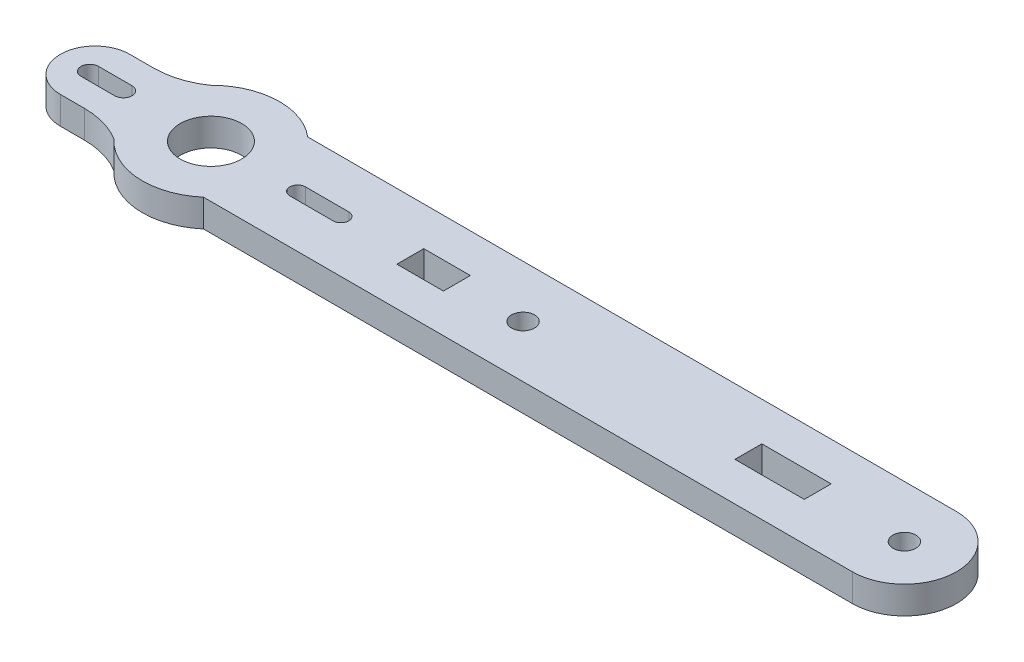
ISO-10303-21;
HEADER;
FILE_DESCRIPTION(('STEP AP214'),'2;1');
FILE_NAME('part.step','',(''),(''),'','','');
FILE_SCHEMA(('AUTOMOTIVE_DESIGN { 1 0 10303 214 1 1 1 1 }'));
ENDSEC;
DATA;
#1=APPLICATION_CONTEXT('core data for automotive mechanical design processes');
#2=APPLICATION_PROTOCOL_DEFINITION('international standard','automotive_design',2000,#1);
#3=PRODUCT_CONTEXT('',#1,'mechanical');
#4=PRODUCT('Part','Part','',(#3));
#5=PRODUCT_RELATED_PRODUCT_CATEGORY('part','',(#4));
#6=PRODUCT_DEFINITION_FORMATION('','',#4);
#7=PRODUCT_DEFINITION_CONTEXT('part definition',#1,'design');
#8=PRODUCT_DEFINITION('design','',#6,#7);
#9=PRODUCT_DEFINITION_SHAPE('','',#8);
#10=(LENGTH_UNIT() NAMED_UNIT(*) SI_UNIT(.MILLI.,.METRE.));
#11=(NAMED_UNIT(*) PLANE_ANGLE_UNIT() SI_UNIT($,.RADIAN.));
#12=(NAMED_UNIT(*) SI_UNIT($,.STERADIAN.) SOLID_ANGLE_UNIT());
#13=UNCERTAINTY_MEASURE_WITH_UNIT(LENGTH_MEASURE(1.E-05),#10,'distance_accuracy_value','');
#14=(GEOMETRIC_REPRESENTATION_CONTEXT(3) GLOBAL_UNCERTAINTY_ASSIGNED_CONTEXT((#13)) GLOBAL_UNIT_ASSIGNED_CONTEXT((#10,
#11,#12)) REPRESENTATION_CONTEXT('',''));
#15=CARTESIAN_POINT('',(0.,0.,0.));
#16=DIRECTION('',(0.,0.,1.));
#17=DIRECTION('',(1.,0.,0.));
#18=AXIS2_PLACEMENT_3D('',#15,#16,#17);
#19=CARTESIAN_POINT('',(-46.1508881650413,3.175,12.73172366087));
#20=DIRECTION('',(0.,-1.,0.));
#21=DIRECTION('',(0.,0.,-1.));
#22=AXIS2_PLACEMENT_3D('',#19,#20,#21);
#23=PLANE('',#22);
#24=CARTESIAN_POINT('',(-20.5826645707768,3.175,-0.385085228693363));
#25=DIRECTION('',(0.,1.,0.));
#26=DIRECTION('',(0.,0.,-1.));
#27=AXIS2_PLACEMENT_3D('',#24,#25,#26);
#28=CIRCLE('',#27,0.899974349717586);
#29=CARTESIAN_POINT('',(-20.5826645707768,3.175,0.514889121024237));
#30=VERTEX_POINT('',#29);
#31=CARTESIAN_POINT('',(-20.5826645707768,3.175,-1.28505957841094));
#32=VERTEX_POINT('',#31);
#33=EDGE_CURVE('E242',#30,#32,#28,.T.);
#34=ORIENTED_EDGE('',*,*,#33,.F.);
#35=DIRECTION('',(1.,0.,0.));
#36=VECTOR('',#35,1.);
#37=CARTESIAN_POINT('',(-20.5826645707768,3.175,0.514889121024237));
#38=LINE('',#37,#36);
#39=CARTESIAN_POINT('',(-25.5738409854409,3.175,0.514889121024237));
#40=VERTEX_POINT('',#39);
#41=EDGE_CURVE('E250',#40,#30,#38,.T.);
#42=ORIENTED_EDGE('',*,*,#41,.F.);
#43=CARTESIAN_POINT('',(-25.5738409854409,3.175,-0.385085228693349));
#44=DIRECTION('',(0.,1.,0.));
#45=DIRECTION('',(0.,0.,1.));
#46=AXIS2_PLACEMENT_3D('',#43,#44,#45);
#47=CIRCLE('',#46,0.899974349717586);
#48=CARTESIAN_POINT('',(-25.5738409854409,3.175,-1.28505957841094));
#49=VERTEX_POINT('',#48);
#50=EDGE_CURVE('E247',#49,#40,#47,.T.);
#51=ORIENTED_EDGE('',*,*,#50,.F.);
#52=DIRECTION('',(-1.,0.,0.));
#53=VECTOR('',#52,1.);
#54=CARTESIAN_POINT('',(-25.5738409854409,3.175,-1.28505957841094));
#55=LINE('',#54,#53);
#56=EDGE_CURVE('E244',#32,#49,#55,.T.);
#57=ORIENTED_EDGE('',*,*,#56,.F.);
#58=EDGE_LOOP('',(#34,#42,#51,#57));
#59=FACE_BOUND('',#58,.T.);
#60=DIRECTION('',(-1.,0.,0.));
#61=VECTOR('',#60,1.);
#62=CARTESIAN_POINT('',(34.3200127772081,3.175,-1.93514359702635));
#63=LINE('',#62,#61);
#64=CARTESIAN_POINT('',(34.3200127772081,3.175,-1.93514359702635));
#65=VERTEX_POINT('',#64);
#66=CARTESIAN_POINT('',(26.3341227148356,3.175,-1.93514359702635));
#67=VERTEX_POINT('',#66);
#68=EDGE_CURVE('E306',#65,#67,#63,.T.);
#69=ORIENTED_EDGE('',*,*,#68,.F.);
#70=DIRECTION('',(0.,0.,-1.));
#71=VECTOR('',#70,1.);
#72=CARTESIAN_POINT('',(34.3200127772081,3.175,1.1148524905702));
#73=LINE('',#72,#71);
#74=CARTESIAN_POINT('',(34.3200127772081,3.175,1.16497314430927));
#75=VERTEX_POINT('',#74);
#76=EDGE_CURVE('E304',#75,#65,#73,.T.);
#77=ORIENTED_EDGE('',*,*,#76,.F.);
#78=DIRECTION('',(1.,0.,0.));
#79=VECTOR('',#78,1.);
#80=CARTESIAN_POINT('',(26.3341227148356,3.175,1.16497314430927));
#81=LINE('',#80,#79);
#82=CARTESIAN_POINT('',(26.3341227148356,3.175,1.16497314430927));
#83=VERTEX_POINT('',#82);
#84=EDGE_CURVE('E311',#83,#75,#81,.T.);
#85=ORIENTED_EDGE('',*,*,#84,.F.);
#86=DIRECTION('',(0.,0.,1.));
#87=VECTOR('',#86,1.);
#88=CARTESIAN_POINT('',(26.3341227148356,3.175,-1.93514359702635));
#89=LINE('',#88,#87);
#90=EDGE_CURVE('E309',#67,#83,#89,.T.);
#91=ORIENTED_EDGE('',*,*,#90,.F.);
#92=EDGE_LOOP('',(#69,#77,#85,#91));
#93=FACE_BOUND('',#92,.T.);
#94=CARTESIAN_POINT('',(-46.1508881650413,3.175,12.73172366087));
#95=DIRECTION('',(0.,-1.,0.));
#96=DIRECTION('',(0.,0.,-1.));
#97=AXIS2_PLACEMENT_3D('',#94,#95,#96);
#98=CIRCLE('',#97,9.12131960573424);
#99=CARTESIAN_POINT('',(-46.1508881650413,3.175,3.61040405513577));
#100=VERTEX_POINT('',#99);
#101=CARTESIAN_POINT('',(-41.3809650965985,3.175,4.95700146190436));
#102=VERTEX_POINT('',#101);
#103=EDGE_CURVE('E353',#100,#102,#98,.T.);
#104=ORIENTED_EDGE('',*,*,#103,.T.);
#105=CARTESIAN_POINT('',(-35.5598693133355,3.175,-0.389755399260115));
#106=DIRECTION('',(0.,1.,0.));
#107=DIRECTION('',(0.,0.,1.));
#108=AXIS2_PLACEMENT_3D('',#105,#106,#107);
#109=CIRCLE('',#108,7.90398412513158);
#110=CARTESIAN_POINT('',(-30.4203086036687,3.175,5.61506606036555));
#111=VERTEX_POINT('',#110);
#112=EDGE_CURVE('E356',#102,#111,#109,.T.);
#113=ORIENTED_EDGE('',*,*,#112,.T.);
#114=DIRECTION('',(1.,0.,0.));
#115=VECTOR('',#114,1.);
#116=CARTESIAN_POINT('',(-30.4203086036687,3.175,5.61506606036555));
#117=LINE('',#116,#115);
#118=CARTESIAN_POINT('',(44.3021859087163,3.175,5.61506606036555));
#119=VERTEX_POINT('',#118);
#120=EDGE_CURVE('E359',#111,#119,#117,.T.);
#121=ORIENTED_EDGE('',*,*,#120,.T.);
#122=CARTESIAN_POINT('',(44.3021859087163,3.175,-0.387483181452966));
#123=DIRECTION('',(0.,1.,0.));
#124=DIRECTION('',(0.,0.,1.));
#125=AXIS2_PLACEMENT_3D('',#122,#123,#124);
#126=CIRCLE('',#125,6.00254924181851);
#127=CARTESIAN_POINT('',(44.3021859087163,3.175,-6.39003242327148));
#128=VERTEX_POINT('',#127);
#129=EDGE_CURVE('E361',#119,#128,#126,.T.);
#130=ORIENTED_EDGE('',*,*,#129,.T.);
#131=DIRECTION('',(-0.999999998208426,0.,-5.98593977840494E-05));
#132=VECTOR('',#131,1.);
#133=CARTESIAN_POINT('',(-30.420224954168,3.175,-6.39450526179472));
#134=LINE('',#133,#132);
#135=CARTESIAN_POINT('',(-30.420224954168,3.175,-6.39450526179472));
#136=VERTEX_POINT('',#135);
#137=EDGE_CURVE('E363',#128,#136,#134,.T.);
#138=ORIENTED_EDGE('',*,*,#137,.T.);
#139=CARTESIAN_POINT('',(-35.5598693133355,3.175,-0.389755399260115));
#140=DIRECTION('',(0.,1.,0.));
#141=DIRECTION('',(0.,0.,1.));
#142=AXIS2_PLACEMENT_3D('',#139,#140,#141);
#143=CIRCLE('',#142,7.90398412513158);
#144=CARTESIAN_POINT('',(-41.2087863988386,3.175,-5.91810965811905));
#145=VERTEX_POINT('',#144);
#146=EDGE_CURVE('E365',#136,#145,#143,.T.);
#147=ORIENTED_EDGE('',*,*,#146,.T.);
#148=CARTESIAN_POINT('',(-46.1508881650413,3.175,-13.1454849063283));
#149=DIRECTION('',(0.,-1.,0.));
#150=DIRECTION('',(0.,0.,1.));
#151=AXIS2_PLACEMENT_3D('',#148,#149,#150);
#152=CIRCLE('',#151,8.75553098595006);
#153=CARTESIAN_POINT('',(-46.1508881650413,3.175,-4.38995392037821));
#154=VERTEX_POINT('',#153);
#155=EDGE_CURVE('E367',#145,#154,#152,.T.);
#156=ORIENTED_EDGE('',*,*,#155,.T.);
#157=DIRECTION('',(-1.,0.,0.));
#158=VECTOR('',#157,1.);
#159=CARTESIAN_POINT('',(-46.1508881650413,3.175,-4.38995392037821));
#160=LINE('',#159,#158);
#161=CARTESIAN_POINT('',(-48.9096652526682,3.175,-4.38995392037821));
#162=VERTEX_POINT('',#161);
#163=EDGE_CURVE('E369',#154,#162,#160,.T.);
#164=ORIENTED_EDGE('',*,*,#163,.T.);
#165=CARTESIAN_POINT('',(-48.9096652526682,3.175,-0.389774932621221));
#166=DIRECTION('',(0.,1.,0.));
#167=DIRECTION('',(0.,0.,1.));
#168=AXIS2_PLACEMENT_3D('',#165,#166,#167);
#169=CIRCLE('',#168,4.00017898775699);
#170=CARTESIAN_POINT('',(-48.9096652526682,3.175,3.61040405513577));
#171=VERTEX_POINT('',#170);
#172=EDGE_CURVE('E371',#162,#171,#169,.T.);
#173=ORIENTED_EDGE('',*,*,#172,.T.);
#174=DIRECTION('',(1.,0.,0.));
#175=VECTOR('',#174,1.);
#176=CARTESIAN_POINT('',(-48.9096652526682,3.175,3.61040405513577));
#177=LINE('',#176,#175);
#178=EDGE_CURVE('E373',#171,#100,#177,.T.);
#179=ORIENTED_EDGE('',*,*,#178,.T.);
#180=EDGE_LOOP('',(#104,#113,#121,#130,#138,#147,#156,#164,#173,#179));
#181=FACE_BOUND('',#180,.T.);
#182=CARTESIAN_POINT('',(44.3021859087163,3.175,-0.387483181452966));
#183=DIRECTION('',(0.,1.,0.));
#184=DIRECTION('',(0.,0.,1.));
#185=AXIS2_PLACEMENT_3D('',#182,#183,#184);
#186=CIRCLE('',#185,1.32262221921054);
#187=CARTESIAN_POINT('',(44.3021859087163,3.175,0.93513903775757));
#188=VERTEX_POINT('',#187);
#189=EDGE_CURVE('E347',#188,#188,#186,.T.);
#190=ORIENTED_EDGE('',*,*,#189,.F.);
#191=EDGE_LOOP('',(#190));
#192=FACE_BOUND('',#191,.T.);
#193=CARTESIAN_POINT('',(0.383109325227615,3.175,-0.385153591561826));
#194=DIRECTION('',(0.,1.,0.));
#195=DIRECTION('',(0.,0.,1.));
#196=AXIS2_PLACEMENT_3D('',#193,#194,#195);
#197=CIRCLE('',#196,1.32262221921054);
#198=CARTESIAN_POINT('',(0.383109325227615,3.175,0.93746862764871));
#199=VERTEX_POINT('',#198);
#200=EDGE_CURVE('E341',#199,#199,#197,.T.);
#201=ORIENTED_EDGE('',*,*,#200,.F.);
#202=EDGE_LOOP('',(#201));
#203=FACE_BOUND('',#202,.T.);
#204=CARTESIAN_POINT('',(-35.5598693133355,3.175,-0.389755399260115));
#205=DIRECTION('',(0.,1.,0.));
#206=DIRECTION('',(0.,0.,1.));
#207=AXIS2_PLACEMENT_3D('',#204,#205,#206);
#208=CIRCLE('',#207,3.54358151821535);
#209=CARTESIAN_POINT('',(-35.5598693133355,3.175,3.15382611895524));
#210=VERTEX_POINT('',#209);
#211=EDGE_CURVE('E335',#210,#210,#208,.T.);
#212=ORIENTED_EDGE('',*,*,#211,.F.);
#213=EDGE_LOOP('',(#212));
#214=FACE_BOUND('',#213,.T.);
#215=DIRECTION('',(0.,0.,-1.));
#216=VECTOR('',#215,1.);
#217=CARTESIAN_POINT('',(-7.23312209646554,3.175,1.16477781654983));
#218=LINE('',#217,#216);
#219=CARTESIAN_POINT('',(-7.23312209646554,3.175,1.16477781654983));
#220=VERTEX_POINT('',#219);
#221=CARTESIAN_POINT('',(-7.23312209646554,3.175,-1.93494827276897));
#222=VERTEX_POINT('',#221);
#223=EDGE_CURVE('E273',#220,#222,#218,.T.);
#224=ORIENTED_EDGE('',*,*,#223,.F.);
#225=DIRECTION('',(1.,0.,0.));
#226=VECTOR('',#225,1.);
#227=CARTESIAN_POINT('',(-12.5967647598336,3.175,1.16477781654983));
#228=LINE('',#227,#226);
#229=CARTESIAN_POINT('',(-12.5967647598336,3.175,1.16477781654983));
#230=VERTEX_POINT('',#229);
#231=EDGE_CURVE('E281',#230,#220,#228,.T.);
#232=ORIENTED_EDGE('',*,*,#231,.F.);
#233=DIRECTION('',(0.,0.,1.));
#234=VECTOR('',#233,1.);
#235=CARTESIAN_POINT('',(-12.5967647598336,3.175,-1.93494827276897));
#236=LINE('',#235,#234);
#237=CARTESIAN_POINT('',(-12.5967647598336,3.175,-1.93494827276897));
#238=VERTEX_POINT('',#237);
#239=EDGE_CURVE('E278',#238,#230,#236,.T.);
#240=ORIENTED_EDGE('',*,*,#239,.F.);
#241=DIRECTION('',(-1.,0.,0.));
#242=VECTOR('',#241,1.);
#243=CARTESIAN_POINT('',(-7.23312209646554,3.175,-1.93494827276897));
#244=LINE('',#243,#242);
#245=EDGE_CURVE('E275',#222,#238,#244,.T.);
#246=ORIENTED_EDGE('',*,*,#245,.F.);
#247=EDGE_LOOP('',(#224,#232,#240,#246));
#248=FACE_BOUND('',#247,.T.);
#249=CARTESIAN_POINT('',(-49.5122186161084,3.175,-0.385182892774616));
#250=DIRECTION('',(0.,1.,0.));
#251=DIRECTION('',(0.,0.,1.));
#252=AXIS2_PLACEMENT_3D('',#249,#250,#251);
#253=CIRCLE('',#252,1.00003986378883);
#254=CARTESIAN_POINT('',(-49.5122186161084,3.175,-1.38522275656344));
#255=VERTEX_POINT('',#254);
#256=CARTESIAN_POINT('',(-49.5122186161084,3.175,0.61485697101421));
#257=VERTEX_POINT('',#256);
#258=EDGE_CURVE('E206',#255,#257,#253,.T.);
#259=ORIENTED_EDGE('',*,*,#258,.F.);
#260=DIRECTION('',(-1.,0.,0.));
#261=VECTOR('',#260,1.);
#262=CARTESIAN_POINT('',(-49.5122186161084,3.175,-1.38522275656344));
#263=LINE('',#262,#261);
#264=CARTESIAN_POINT('',(-45.6380802478693,3.175,-1.38522275656344));
#265=VERTEX_POINT('',#264);
#266=EDGE_CURVE('E228',#265,#255,#263,.T.);
#267=ORIENTED_EDGE('',*,*,#266,.F.);
#268=CARTESIAN_POINT('',(-45.6380802478693,3.175,-0.385182892774616));
#269=DIRECTION('',(0.,1.,0.));
#270=DIRECTION('',(0.,0.,-1.));
#271=AXIS2_PLACEMENT_3D('',#268,#269,#270);
#272=CIRCLE('',#271,1.00003986378883);
#273=CARTESIAN_POINT('',(-45.6380802478693,3.175,0.61485697101421));
#274=VERTEX_POINT('',#273);
#275=EDGE_CURVE('E226',#274,#265,#272,.T.);
#276=ORIENTED_EDGE('',*,*,#275,.F.);
#277=DIRECTION('',(1.,0.,0.));
#278=VECTOR('',#277,1.);
#279=CARTESIAN_POINT('',(-45.6380802478693,3.175,0.61485697101421));
#280=LINE('',#279,#278);
#281=EDGE_CURVE('E214',#257,#274,#280,.T.);
#282=ORIENTED_EDGE('',*,*,#281,.F.);
#283=EDGE_LOOP('',(#259,#267,#276,#282));
#284=FACE_BOUND('',#283,.T.);
#285=ADVANCED_FACE('F33',(#59,#93,#181,#192,#203,#214,#248,#284),#23,.F.);
#286=CARTESIAN_POINT('',(-46.1508881650413,0.,12.73172366087));
#287=DIRECTION('',(0.,-1.,0.));
#288=DIRECTION('',(0.,0.,-1.));
#289=AXIS2_PLACEMENT_3D('',#286,#287,#288);
#290=PLANE('',#289);
#291=CARTESIAN_POINT('',(0.383109325227615,0.,-0.385153591561826));
#292=DIRECTION('',(0.,1.,0.));
#293=DIRECTION('',(0.,0.,1.));
#294=AXIS2_PLACEMENT_3D('',#291,#292,#293);
#295=CIRCLE('',#294,1.32262221921054);
#296=CARTESIAN_POINT('',(0.383109325227615,0.,0.93746862764871));
#297=VERTEX_POINT('',#296);
#298=EDGE_CURVE('E338',#297,#297,#295,.T.);
#299=ORIENTED_EDGE('',*,*,#298,.T.);
#300=EDGE_LOOP('',(#299));
#301=FACE_BOUND('',#300,.T.);
#302=CARTESIAN_POINT('',(-46.1508881650413,0.,12.73172366087));
#303=DIRECTION('',(0.,-1.,0.));
#304=DIRECTION('',(0.,0.,-1.));
#305=AXIS2_PLACEMENT_3D('',#302,#303,#304);
#306=CIRCLE('',#305,9.12131960573424);
#307=CARTESIAN_POINT('',(-46.1508881650413,0.,3.61040405513577));
#308=VERTEX_POINT('',#307);
#309=CARTESIAN_POINT('',(-41.3809650965985,0.,4.95700146190436));
#310=VERTEX_POINT('',#309);
#311=EDGE_CURVE('E350',#308,#310,#306,.T.);
#312=ORIENTED_EDGE('',*,*,#311,.F.);
#313=DIRECTION('',(1.,0.,0.));
#314=VECTOR('',#313,1.);
#315=CARTESIAN_POINT('',(-48.9096652526682,0.,3.61040405513577));
#316=LINE('',#315,#314);
#317=CARTESIAN_POINT('',(-48.9096652526682,0.,3.61040405513577));
#318=VERTEX_POINT('',#317);
#319=EDGE_CURVE('E357',#318,#308,#316,.T.);
#320=ORIENTED_EDGE('',*,*,#319,.F.);
#321=CARTESIAN_POINT('',(-48.9096652526682,0.,-0.389774932621221));
#322=DIRECTION('',(0.,1.,0.));
#323=DIRECTION('',(0.,0.,1.));
#324=AXIS2_PLACEMENT_3D('',#321,#322,#323);
#325=CIRCLE('',#324,4.00017898775699);
#326=CARTESIAN_POINT('',(-48.9096652526682,0.,-4.38995392037821));
#327=VERTEX_POINT('',#326);
#328=EDGE_CURVE('E392',#327,#318,#325,.T.);
#329=ORIENTED_EDGE('',*,*,#328,.F.);
#330=DIRECTION('',(-1.,0.,0.));
#331=VECTOR('',#330,1.);
#332=CARTESIAN_POINT('',(-46.1508881650413,0.,-4.38995392037821));
#333=LINE('',#332,#331);
#334=CARTESIAN_POINT('',(-46.1508881650413,0.,-4.38995392037821));
#335=VERTEX_POINT('',#334);
#336=EDGE_CURVE('E390',#335,#327,#333,.T.);
#337=ORIENTED_EDGE('',*,*,#336,.F.);
#338=CARTESIAN_POINT('',(-46.1508881650413,0.,-13.1454849063283));
#339=DIRECTION('',(0.,-1.,0.));
#340=DIRECTION('',(0.,0.,1.));
#341=AXIS2_PLACEMENT_3D('',#338,#339,#340);
#342=CIRCLE('',#341,8.75553098595006);
#343=CARTESIAN_POINT('',(-41.2087863988386,0.,-5.91810965811905));
#344=VERTEX_POINT('',#343);
#345=EDGE_CURVE('E388',#344,#335,#342,.T.);
#346=ORIENTED_EDGE('',*,*,#345,.F.);
#347=CARTESIAN_POINT('',(-35.5598693133355,0.,-0.389755399260115));
#348=DIRECTION('',(0.,1.,0.));
#349=DIRECTION('',(0.,0.,1.));
#350=AXIS2_PLACEMENT_3D('',#347,#348,#349);
#351=CIRCLE('',#350,7.90398412513158);
#352=CARTESIAN_POINT('',(-30.420224954168,0.,-6.39450526179472));
#353=VERTEX_POINT('',#352);
#354=EDGE_CURVE('E386',#353,#344,#351,.T.);
#355=ORIENTED_EDGE('',*,*,#354,.F.);
#356=DIRECTION('',(-0.999999998208426,0.,-5.98593977840494E-05));
#357=VECTOR('',#356,1.);
#358=CARTESIAN_POINT('',(-30.420224954168,0.,-6.39450526179472));
#359=LINE('',#358,#357);
#360=CARTESIAN_POINT('',(44.3021859087163,0.,-6.39003242327148));
#361=VERTEX_POINT('',#360);
#362=EDGE_CURVE('E384',#361,#353,#359,.T.);
#363=ORIENTED_EDGE('',*,*,#362,.F.);
#364=CARTESIAN_POINT('',(44.3021859087163,0.,-0.387483181452966));
#365=DIRECTION('',(0.,1.,0.));
#366=DIRECTION('',(0.,0.,1.));
#367=AXIS2_PLACEMENT_3D('',#364,#365,#366);
#368=CIRCLE('',#367,6.00254924181851);
#369=CARTESIAN_POINT('',(44.3021859087163,0.,5.61506606036555));
#370=VERTEX_POINT('',#369);
#371=EDGE_CURVE('E382',#370,#361,#368,.T.);
#372=ORIENTED_EDGE('',*,*,#371,.F.);
#373=DIRECTION('',(1.,0.,0.));
#374=VECTOR('',#373,1.);
#375=CARTESIAN_POINT('',(-30.4203086036687,0.,5.61506606036555));
#376=LINE('',#375,#374);
#377=CARTESIAN_POINT('',(-30.4203086036687,0.,5.61506606036555));
#378=VERTEX_POINT('',#377);
#379=EDGE_CURVE('E380',#378,#370,#376,.T.);
#380=ORIENTED_EDGE('',*,*,#379,.F.);
#381=CARTESIAN_POINT('',(-35.5598693133355,0.,-0.389755399260115));
#382=DIRECTION('',(0.,1.,0.));
#383=DIRECTION('',(0.,0.,1.));
#384=AXIS2_PLACEMENT_3D('',#381,#382,#383);
#385=CIRCLE('',#384,7.90398412513158);
#386=EDGE_CURVE('E378',#310,#378,#385,.T.);
#387=ORIENTED_EDGE('',*,*,#386,.F.);
#388=EDGE_LOOP('',(#312,#320,#329,#337,#346,#355,#363,#372,#380,#387));
#389=FACE_BOUND('',#388,.T.);
#390=CARTESIAN_POINT('',(44.3021859087163,0.,-0.387483181452966));
#391=DIRECTION('',(0.,1.,0.));
#392=DIRECTION('',(0.,0.,1.));
#393=AXIS2_PLACEMENT_3D('',#390,#391,#392);
#394=CIRCLE('',#393,1.32262221921054);
#395=CARTESIAN_POINT('',(44.3021859087163,0.,0.93513903775757));
#396=VERTEX_POINT('',#395);
#397=EDGE_CURVE('E344',#396,#396,#394,.T.);
#398=ORIENTED_EDGE('',*,*,#397,.T.);
#399=EDGE_LOOP('',(#398));
#400=FACE_BOUND('',#399,.T.);
#401=CARTESIAN_POINT('',(-35.5598693133355,0.,-0.389755399260115));
#402=DIRECTION('',(0.,1.,0.));
#403=DIRECTION('',(0.,0.,1.));
#404=AXIS2_PLACEMENT_3D('',#401,#402,#403);
#405=CIRCLE('',#404,3.54358151821535);
#406=CARTESIAN_POINT('',(-35.5598693133355,0.,3.15382611895524));
#407=VERTEX_POINT('',#406);
#408=EDGE_CURVE('E334',#407,#407,#405,.T.);
#409=ORIENTED_EDGE('',*,*,#408,.T.);
#410=EDGE_LOOP('',(#409));
#411=FACE_BOUND('',#410,.T.);
#412=DIRECTION('',(0.,0.,-1.));
#413=VECTOR('',#412,1.);
#414=CARTESIAN_POINT('',(34.3200127772081,0.,1.16497314430927));
#415=LINE('',#414,#413);
#416=CARTESIAN_POINT('',(34.3200127772081,0.,1.16497314430927));
#417=VERTEX_POINT('',#416);
#418=CARTESIAN_POINT('',(34.3200127772081,0.,-1.93514359702635));
#419=VERTEX_POINT('',#418);
#420=EDGE_CURVE('E307',#417,#419,#415,.T.);
#421=ORIENTED_EDGE('',*,*,#420,.T.);
#422=DIRECTION('',(-1.,0.,0.));
#423=VECTOR('',#422,1.);
#424=CARTESIAN_POINT('',(34.3200127772081,0.,-1.93514359702635));
#425=LINE('',#424,#423);
#426=CARTESIAN_POINT('',(26.3341227148356,0.,-1.93514359702635));
#427=VERTEX_POINT('',#426);
#428=EDGE_CURVE('E303',#419,#427,#425,.T.);
#429=ORIENTED_EDGE('',*,*,#428,.T.);
#430=DIRECTION('',(0.,0.,1.));
#431=VECTOR('',#430,1.);
#432=CARTESIAN_POINT('',(26.3341227148356,0.,1.11485249056983));
#433=LINE('',#432,#431);
#434=CARTESIAN_POINT('',(26.3341227148356,0.,1.16497314430927));
#435=VERTEX_POINT('',#434);
#436=EDGE_CURVE('E317',#427,#435,#433,.T.);
#437=ORIENTED_EDGE('',*,*,#436,.T.);
#438=DIRECTION('',(1.,0.,0.));
#439=VECTOR('',#438,1.);
#440=CARTESIAN_POINT('',(26.3341227148356,0.,1.16497314430927));
#441=LINE('',#440,#439);
#442=EDGE_CURVE('E320',#435,#417,#441,.T.);
#443=ORIENTED_EDGE('',*,*,#442,.T.);
#444=EDGE_LOOP('',(#421,#429,#437,#443));
#445=FACE_BOUND('',#444,.T.);
#446=DIRECTION('',(1.,0.,0.));
#447=VECTOR('',#446,1.);
#448=CARTESIAN_POINT('',(-12.5967647598336,0.,1.16477781654983));
#449=LINE('',#448,#447);
#450=CARTESIAN_POINT('',(-12.5967647598336,0.,1.16477781654983));
#451=VERTEX_POINT('',#450);
#452=CARTESIAN_POINT('',(-7.23312209646554,0.,1.16477781654983));
#453=VERTEX_POINT('',#452);
#454=EDGE_CURVE('E276',#451,#453,#449,.T.);
#455=ORIENTED_EDGE('',*,*,#454,.T.);
#456=DIRECTION('',(0.,0.,-1.));
#457=VECTOR('',#456,1.);
#458=CARTESIAN_POINT('',(-7.23312209646554,0.,1.16477781654983));
#459=LINE('',#458,#457);
#460=CARTESIAN_POINT('',(-7.23312209646554,0.,-1.93494827276897));
#461=VERTEX_POINT('',#460);
#462=EDGE_CURVE('E272',#453,#461,#459,.T.);
#463=ORIENTED_EDGE('',*,*,#462,.T.);
#464=DIRECTION('',(-1.,0.,0.));
#465=VECTOR('',#464,1.);
#466=CARTESIAN_POINT('',(-7.23312209646554,0.,-1.93494827276897));
#467=LINE('',#466,#465);
#468=CARTESIAN_POINT('',(-12.5967647598336,0.,-1.93494827276897));
#469=VERTEX_POINT('',#468);
#470=EDGE_CURVE('E286',#461,#469,#467,.T.);
#471=ORIENTED_EDGE('',*,*,#470,.T.);
#472=DIRECTION('',(0.,0.,1.));
#473=VECTOR('',#472,1.);
#474=CARTESIAN_POINT('',(-12.5967647598336,0.,-1.93494827276897));
#475=LINE('',#474,#473);
#476=EDGE_CURVE('E289',#469,#451,#475,.T.);
#477=ORIENTED_EDGE('',*,*,#476,.T.);
#478=EDGE_LOOP('',(#455,#463,#471,#477));
#479=FACE_BOUND('',#478,.T.);
#480=DIRECTION('',(1.,0.,0.));
#481=VECTOR('',#480,1.);
#482=CARTESIAN_POINT('',(-20.5826645707768,0.,0.514889121024237));
#483=LINE('',#482,#481);
#484=CARTESIAN_POINT('',(-25.5738409854409,0.,0.514889121024237));
#485=VERTEX_POINT('',#484);
#486=CARTESIAN_POINT('',(-20.5826645707768,0.,0.514889121024237));
#487=VERTEX_POINT('',#486);
#488=EDGE_CURVE('E245',#485,#487,#483,.T.);
#489=ORIENTED_EDGE('',*,*,#488,.T.);
#490=CARTESIAN_POINT('',(-20.5826645707768,0.,-0.385085228693363));
#491=DIRECTION('',(0.,1.,0.));
#492=DIRECTION('',(0.,0.,-1.));
#493=AXIS2_PLACEMENT_3D('',#490,#491,#492);
#494=CIRCLE('',#493,0.899974349717586);
#495=CARTESIAN_POINT('',(-20.5826645707768,0.,-1.28505957841094));
#496=VERTEX_POINT('',#495);
#497=EDGE_CURVE('E222',#487,#496,#494,.T.);
#498=ORIENTED_EDGE('',*,*,#497,.T.);
#499=DIRECTION('',(-1.,0.,0.));
#500=VECTOR('',#499,1.);
#501=CARTESIAN_POINT('',(-25.5738409854409,0.,-1.28505957841094));
#502=LINE('',#501,#500);
#503=CARTESIAN_POINT('',(-25.5738409854409,0.,-1.28505957841094));
#504=VERTEX_POINT('',#503);
#505=EDGE_CURVE('E255',#496,#504,#502,.T.);
#506=ORIENTED_EDGE('',*,*,#505,.T.);
#507=CARTESIAN_POINT('',(-25.5738409854409,0.,-0.385085228693349));
#508=DIRECTION('',(0.,1.,0.));
#509=DIRECTION('',(0.,0.,1.));
#510=AXIS2_PLACEMENT_3D('',#507,#508,#509);
#511=CIRCLE('',#510,0.899974349717586);
#512=EDGE_CURVE('E258',#504,#485,#511,.T.);
#513=ORIENTED_EDGE('',*,*,#512,.T.);
#514=EDGE_LOOP('',(#489,#498,#506,#513));
#515=FACE_BOUND('',#514,.T.);
#516=DIRECTION('',(-1.,0.,0.));
#517=VECTOR('',#516,1.);
#518=CARTESIAN_POINT('',(-49.5122186161084,0.,-1.38522275656344));
#519=LINE('',#518,#517);
#520=CARTESIAN_POINT('',(-45.6380802478693,0.,-1.38522275656344));
#521=VERTEX_POINT('',#520);
#522=CARTESIAN_POINT('',(-49.5122186161084,0.,-1.38522275656344));
#523=VERTEX_POINT('',#522);
#524=EDGE_CURVE('E215',#521,#523,#519,.T.);
#525=ORIENTED_EDGE('',*,*,#524,.T.);
#526=CARTESIAN_POINT('',(-49.5122186161084,0.,-0.385182892774616));
#527=DIRECTION('',(0.,1.,0.));
#528=DIRECTION('',(0.,0.,1.));
#529=AXIS2_PLACEMENT_3D('',#526,#527,#528);
#530=CIRCLE('',#529,1.00003986378883);
#531=CARTESIAN_POINT('',(-49.5122186161084,0.,0.61485697101421));
#532=VERTEX_POINT('',#531);
#533=EDGE_CURVE('E56',#523,#532,#530,.T.);
#534=ORIENTED_EDGE('',*,*,#533,.T.);
#535=DIRECTION('',(1.,0.,0.));
#536=VECTOR('',#535,1.);
#537=CARTESIAN_POINT('',(-45.6380802478693,0.,0.61485697101421));
#538=LINE('',#537,#536);
#539=CARTESIAN_POINT('',(-45.6380802478693,0.,0.61485697101421));
#540=VERTEX_POINT('',#539);
#541=EDGE_CURVE('E221',#532,#540,#538,.T.);
#542=ORIENTED_EDGE('',*,*,#541,.T.);
#543=CARTESIAN_POINT('',(-45.6380802478693,0.,-0.385182892774616));
#544=DIRECTION('',(0.,1.,0.));
#545=DIRECTION('',(0.,0.,-1.));
#546=AXIS2_PLACEMENT_3D('',#543,#544,#545);
#547=CIRCLE('',#546,1.00003986378883);
#548=EDGE_CURVE('E234',#540,#521,#547,.T.);
#549=ORIENTED_EDGE('',*,*,#548,.T.);
#550=EDGE_LOOP('',(#525,#534,#542,#549));
#551=FACE_BOUND('',#550,.T.);
#552=ADVANCED_FACE('F428',(#301,#389,#400,#411,#445,#479,#515,#551),#290,.T.);
#553=CARTESIAN_POINT('',(-46.1508881650413,3.175,12.73172366087));
#554=DIRECTION('',(0.,-1.,0.));
#555=DIRECTION('',(0.,0.,-1.));
#556=AXIS2_PLACEMENT_3D('',#553,#554,#555);
#557=CYLINDRICAL_SURFACE('',#556,9.12131960573424);
#558=ORIENTED_EDGE('',*,*,#311,.T.);
#559=DIRECTION('',(0.,-1.,0.));
#560=VECTOR('',#559,1.);
#561=CARTESIAN_POINT('',(-41.3809650965985,3.175,4.95700146190436));
#562=LINE('',#561,#560);
#563=EDGE_CURVE('E11',#102,#310,#562,.T.);
#564=ORIENTED_EDGE('',*,*,#563,.F.);
#565=ORIENTED_EDGE('',*,*,#103,.F.);
#566=DIRECTION('',(0.,-1.,0.));
#567=VECTOR('',#566,1.);
#568=CARTESIAN_POINT('',(-46.1508881650413,3.175,3.61040405513577));
#569=LINE('',#568,#567);
#570=EDGE_CURVE('E375',#100,#308,#569,.T.);
#571=ORIENTED_EDGE('',*,*,#570,.T.);
#572=EDGE_LOOP('',(#558,#564,#565,#571));
#573=FACE_BOUND('',#572,.T.);
#574=ADVANCED_FACE('F35',(#573),#557,.F.);
#575=CARTESIAN_POINT('',(-35.5598693133355,3.175,-0.389755399260115));
#576=DIRECTION('',(0.,-1.,0.));
#577=DIRECTION('',(0.,0.,-1.));
#578=AXIS2_PLACEMENT_3D('',#575,#576,#577);
#579=CYLINDRICAL_SURFACE('',#578,7.90398412513158);
#580=ORIENTED_EDGE('',*,*,#386,.T.);
#581=DIRECTION('',(0.,-1.,0.));
#582=VECTOR('',#581,1.);
#583=CARTESIAN_POINT('',(-30.4203086036687,3.175,5.61506606036555));
#584=LINE('',#583,#582);
#585=EDGE_CURVE('E41',#111,#378,#584,.T.);
#586=ORIENTED_EDGE('',*,*,#585,.F.);
#587=ORIENTED_EDGE('',*,*,#112,.F.);
#588=ORIENTED_EDGE('',*,*,#563,.T.);
#589=EDGE_LOOP('',(#580,#586,#587,#588));
#590=FACE_BOUND('',#589,.T.);
#591=ADVANCED_FACE('F446',(#590),#579,.T.);
#592=CARTESIAN_POINT('',(-30.4203086036687,3.175,5.61506606036555));
#593=DIRECTION('',(0.,0.,-1.));
#594=DIRECTION('',(-1.,0.,0.));
#595=AXIS2_PLACEMENT_3D('',#592,#593,#594);
#596=PLANE('',#595);
#597=ORIENTED_EDGE('',*,*,#379,.T.);
#598=DIRECTION('',(0.,-1.,0.));
#599=VECTOR('',#598,1.);
#600=CARTESIAN_POINT('',(44.3021859087163,3.175,5.61506606036555));
#601=LINE('',#600,#599);
#602=EDGE_CURVE('E415',#119,#370,#601,.T.);
#603=ORIENTED_EDGE('',*,*,#602,.F.);
#604=ORIENTED_EDGE('',*,*,#120,.F.);
#605=ORIENTED_EDGE('',*,*,#585,.T.);
#606=EDGE_LOOP('',(#597,#603,#604,#605));
#607=FACE_BOUND('',#606,.T.);
#608=ADVANCED_FACE('F422',(#607),#596,.F.);
#609=CARTESIAN_POINT('',(44.3021859087163,3.175,-0.387483181452966));
#610=DIRECTION('',(0.,-1.,0.));
#611=DIRECTION('',(0.,0.,-1.));
#612=AXIS2_PLACEMENT_3D('',#609,#610,#611);
#613=CYLINDRICAL_SURFACE('',#612,6.00254924181851);
#614=ORIENTED_EDGE('',*,*,#371,.T.);
#615=DIRECTION('',(0.,-1.,0.));
#616=VECTOR('',#615,1.);
#617=CARTESIAN_POINT('',(44.3021859087163,3.175,-6.39003242327148));
#618=LINE('',#617,#616);
#619=EDGE_CURVE('E412',#128,#361,#618,.T.);
#620=ORIENTED_EDGE('',*,*,#619,.F.);
#621=ORIENTED_EDGE('',*,*,#129,.F.);
#622=ORIENTED_EDGE('',*,*,#602,.T.);
#623=EDGE_LOOP('',(#614,#620,#621,#622));
#624=FACE_BOUND('',#623,.T.);
#625=ADVANCED_FACE('F434',(#624),#613,.T.);
#626=CARTESIAN_POINT('',(-30.420224954168,3.175,-6.39450526179472));
#627=DIRECTION('',(-5.98593977840493E-05,0.,0.999999998208426));
#628=DIRECTION('',(0.999999998208426,0.,5.98593977840494E-05));
#629=AXIS2_PLACEMENT_3D('',#626,#627,#628);
#630=PLANE('',#629);
#631=ORIENTED_EDGE('',*,*,#362,.T.);
#632=DIRECTION('',(0.,-1.,0.));
#633=VECTOR('',#632,1.);
#634=CARTESIAN_POINT('',(-30.420224954168,3.175,-6.39450526179472));
#635=LINE('',#634,#633);
#636=EDGE_CURVE('E409',#136,#353,#635,.T.);
#637=ORIENTED_EDGE('',*,*,#636,.F.);
#638=ORIENTED_EDGE('',*,*,#137,.F.);
#639=ORIENTED_EDGE('',*,*,#619,.T.);
#640=EDGE_LOOP('',(#631,#637,#638,#639));
#641=FACE_BOUND('',#640,.T.);
#642=ADVANCED_FACE('F438',(#641),#630,.F.);
#643=CARTESIAN_POINT('',(-35.5598693133355,3.175,-0.389755399260115));
#644=DIRECTION('',(0.,-1.,0.));
#645=DIRECTION('',(0.,0.,-1.));
#646=AXIS2_PLACEMENT_3D('',#643,#644,#645);
#647=CYLINDRICAL_SURFACE('',#646,7.90398412513158);
#648=ORIENTED_EDGE('',*,*,#354,.T.);
#649=DIRECTION('',(0.,-1.,0.));
#650=VECTOR('',#649,1.);
#651=CARTESIAN_POINT('',(-41.2087863988386,3.175,-5.91810965811905));
#652=LINE('',#651,#650);
#653=EDGE_CURVE('E406',#145,#344,#652,.T.);
#654=ORIENTED_EDGE('',*,*,#653,.F.);
#655=ORIENTED_EDGE('',*,*,#146,.F.);
#656=ORIENTED_EDGE('',*,*,#636,.T.);
#657=EDGE_LOOP('',(#648,#654,#655,#656));
#658=FACE_BOUND('',#657,.T.);
#659=ADVANCED_FACE('F469',(#658),#647,.T.);
#660=CARTESIAN_POINT('',(-46.1508881650413,3.175,-13.1454849063283));
#661=DIRECTION('',(0.,-1.,0.));
#662=DIRECTION('',(0.,0.,-1.));
#663=AXIS2_PLACEMENT_3D('',#660,#661,#662);
#664=CYLINDRICAL_SURFACE('',#663,8.75553098595006);
#665=ORIENTED_EDGE('',*,*,#345,.T.);
#666=DIRECTION('',(0.,-1.,0.));
#667=VECTOR('',#666,1.);
#668=CARTESIAN_POINT('',(-46.1508881650413,3.175,-4.38995392037821));
#669=LINE('',#668,#667);
#670=EDGE_CURVE('E403',#154,#335,#669,.T.);
#671=ORIENTED_EDGE('',*,*,#670,.F.);
#672=ORIENTED_EDGE('',*,*,#155,.F.);
#673=ORIENTED_EDGE('',*,*,#653,.T.);
#674=EDGE_LOOP('',(#665,#671,#672,#673));
#675=FACE_BOUND('',#674,.T.);
#676=ADVANCED_FACE('F466',(#675),#664,.F.);
#677=CARTESIAN_POINT('',(-46.1508881650413,3.175,-4.38995392037821));
#678=DIRECTION('',(0.,0.,1.));
#679=DIRECTION('',(1.,0.,0.));
#680=AXIS2_PLACEMENT_3D('',#677,#678,#679);
#681=PLANE('',#680);
#682=ORIENTED_EDGE('',*,*,#336,.T.);
#683=DIRECTION('',(0.,-1.,0.));
#684=VECTOR('',#683,1.);
#685=CARTESIAN_POINT('',(-48.9096652526682,3.175,-4.38995392037821));
#686=LINE('',#685,#684);
#687=EDGE_CURVE('E400',#162,#327,#686,.T.);
#688=ORIENTED_EDGE('',*,*,#687,.F.);
#689=ORIENTED_EDGE('',*,*,#163,.F.);
#690=ORIENTED_EDGE('',*,*,#670,.T.);
#691=EDGE_LOOP('',(#682,#688,#689,#690));
#692=FACE_BOUND('',#691,.T.);
#693=ADVANCED_FACE('F462',(#692),#681,.F.);
#694=CARTESIAN_POINT('',(-48.9096652526682,3.175,-0.389774932621221));
#695=DIRECTION('',(0.,-1.,0.));
#696=DIRECTION('',(0.,0.,-1.));
#697=AXIS2_PLACEMENT_3D('',#694,#695,#696);
#698=CYLINDRICAL_SURFACE('',#697,4.00017898775699);
#699=ORIENTED_EDGE('',*,*,#328,.T.);
#700=DIRECTION('',(0.,-1.,0.));
#701=VECTOR('',#700,1.);
#702=CARTESIAN_POINT('',(-48.9096652526682,3.175,3.61040405513577));
#703=LINE('',#702,#701);
#704=EDGE_CURVE('E397',#171,#318,#703,.T.);
#705=ORIENTED_EDGE('',*,*,#704,.F.);
#706=ORIENTED_EDGE('',*,*,#172,.F.);
#707=ORIENTED_EDGE('',*,*,#687,.T.);
#708=EDGE_LOOP('',(#699,#705,#706,#707));
#709=FACE_BOUND('',#708,.T.);
#710=ADVANCED_FACE('F458',(#709),#698,.T.);
#711=CARTESIAN_POINT('',(-48.9096652526682,3.175,3.61040405513577));
#712=DIRECTION('',(0.,0.,-1.));
#713=DIRECTION('',(-1.,0.,0.));
#714=AXIS2_PLACEMENT_3D('',#711,#712,#713);
#715=PLANE('',#714);
#716=ORIENTED_EDGE('',*,*,#319,.T.);
#717=ORIENTED_EDGE('',*,*,#570,.F.);
#718=ORIENTED_EDGE('',*,*,#178,.F.);
#719=ORIENTED_EDGE('',*,*,#704,.T.);
#720=EDGE_LOOP('',(#716,#717,#718,#719));
#721=FACE_BOUND('',#720,.T.);
#722=ADVANCED_FACE('F453',(#721),#715,.F.);
#723=CARTESIAN_POINT('',(44.3021859087163,3.175,-0.387483181452966));
#724=DIRECTION('',(0.,-1.,0.));
#725=DIRECTION('',(0.,0.,-1.));
#726=AXIS2_PLACEMENT_3D('',#723,#724,#725);
#727=CYLINDRICAL_SURFACE('',#726,1.32262221921054);
#728=ORIENTED_EDGE('',*,*,#189,.T.);
#729=EDGE_LOOP('',(#728));
#730=FACE_BOUND('',#729,.T.);
#731=ORIENTED_EDGE('',*,*,#397,.F.);
#732=EDGE_LOOP('',(#731));
#733=FACE_BOUND('',#732,.T.);
#734=ADVANCED_FACE('F489',(#730,#733),#727,.F.);
#735=CARTESIAN_POINT('',(0.383109325227615,3.175,-0.385153591561826));
#736=DIRECTION('',(0.,-1.,0.));
#737=DIRECTION('',(0.,0.,-1.));
#738=AXIS2_PLACEMENT_3D('',#735,#736,#737);
#739=CYLINDRICAL_SURFACE('',#738,1.32262221921054);
#740=ORIENTED_EDGE('',*,*,#200,.T.);
#741=EDGE_LOOP('',(#740));
#742=FACE_BOUND('',#741,.T.);
#743=ORIENTED_EDGE('',*,*,#298,.F.);
#744=EDGE_LOOP('',(#743));
#745=FACE_BOUND('',#744,.T.);
#746=ADVANCED_FACE('F515',(#742,#745),#739,.F.);
#747=CARTESIAN_POINT('',(-35.5598693133355,3.175,-0.389755399260115));
#748=DIRECTION('',(0.,-1.,0.));
#749=DIRECTION('',(0.,0.,-1.));
#750=AXIS2_PLACEMENT_3D('',#747,#748,#749);
#751=CYLINDRICAL_SURFACE('',#750,3.54358151821535);
#752=ORIENTED_EDGE('',*,*,#211,.T.);
#753=EDGE_LOOP('',(#752));
#754=FACE_BOUND('',#753,.T.);
#755=ORIENTED_EDGE('',*,*,#408,.F.);
#756=EDGE_LOOP('',(#755));
#757=FACE_BOUND('',#756,.T.);
#758=ADVANCED_FACE('F522',(#754,#757),#751,.F.);
#759=CARTESIAN_POINT('',(34.3200127772081,3.175,-1.93514359702635));
#760=DIRECTION('',(0.,0.,1.));
#761=DIRECTION('',(1.,0.,0.));
#762=AXIS2_PLACEMENT_3D('',#759,#760,#761);
#763=PLANE('',#762);
#764=ORIENTED_EDGE('',*,*,#428,.F.);
#765=DIRECTION('',(0.,-1.,0.));
#766=VECTOR('',#765,1.);
#767=CARTESIAN_POINT('',(34.3200127772081,3.175,-1.93514359702635));
#768=LINE('',#767,#766);
#769=EDGE_CURVE('E331',#65,#419,#768,.T.);
#770=ORIENTED_EDGE('',*,*,#769,.F.);
#771=ORIENTED_EDGE('',*,*,#68,.T.);
#772=DIRECTION('',(0.,-1.,0.));
#773=VECTOR('',#772,1.);
#774=CARTESIAN_POINT('',(26.3341227148356,3.175,-1.93514359702635));
#775=LINE('',#774,#773);
#776=EDGE_CURVE('E328',#67,#427,#775,.T.);
#777=ORIENTED_EDGE('',*,*,#776,.T.);
#778=EDGE_LOOP('',(#764,#770,#771,#777));
#779=FACE_BOUND('',#778,.T.);
#780=ADVANCED_FACE('F529',(#779),#763,.T.);
#781=CARTESIAN_POINT('',(26.3341227148356,3.175,1.11485249056983));
#782=DIRECTION('',(1.,0.,0.));
#783=DIRECTION('',(0.,0.,-1.));
#784=AXIS2_PLACEMENT_3D('',#781,#782,#783);
#785=PLANE('',#784);
#786=ORIENTED_EDGE('',*,*,#436,.F.);
#787=ORIENTED_EDGE('',*,*,#776,.F.);
#788=ORIENTED_EDGE('',*,*,#90,.T.);
#789=DIRECTION('',(0.,-1.,0.));
#790=VECTOR('',#789,1.);
#791=CARTESIAN_POINT('',(26.3341227148356,3.175,1.16497314430927));
#792=LINE('',#791,#790);
#793=EDGE_CURVE('E326',#83,#435,#792,.T.);
#794=ORIENTED_EDGE('',*,*,#793,.T.);
#795=EDGE_LOOP('',(#786,#787,#788,#794));
#796=FACE_BOUND('',#795,.T.);
#797=ADVANCED_FACE('F537',(#796),#785,.T.);
#798=CARTESIAN_POINT('',(26.3341227148356,3.175,1.16497314430927));
#799=DIRECTION('',(0.,0.,-1.));
#800=DIRECTION('',(-1.,0.,0.));
#801=AXIS2_PLACEMENT_3D('',#798,#799,#800);
#802=PLANE('',#801);
#803=ORIENTED_EDGE('',*,*,#442,.F.);
#804=ORIENTED_EDGE('',*,*,#793,.F.);
#805=ORIENTED_EDGE('',*,*,#84,.T.);
#806=DIRECTION('',(0.,-1.,0.));
#807=VECTOR('',#806,1.);
#808=CARTESIAN_POINT('',(34.3200127772081,3.175,1.16497314430927));
#809=LINE('',#808,#807);
#810=EDGE_CURVE('E314',#75,#417,#809,.T.);
#811=ORIENTED_EDGE('',*,*,#810,.T.);
#812=EDGE_LOOP('',(#803,#804,#805,#811));
#813=FACE_BOUND('',#812,.T.);
#814=ADVANCED_FACE('F545',(#813),#802,.T.);
#815=CARTESIAN_POINT('',(34.3200127772081,3.175,1.16497314430927));
#816=DIRECTION('',(-1.,0.,0.));
#817=DIRECTION('',(0.,0.,1.));
#818=AXIS2_PLACEMENT_3D('',#815,#816,#817);
#819=PLANE('',#818);
#820=ORIENTED_EDGE('',*,*,#420,.F.);
#821=ORIENTED_EDGE('',*,*,#810,.F.);
#822=ORIENTED_EDGE('',*,*,#76,.T.);
#823=ORIENTED_EDGE('',*,*,#769,.T.);
#824=EDGE_LOOP('',(#820,#821,#822,#823));
#825=FACE_BOUND('',#824,.T.);
#826=ADVANCED_FACE('F553',(#825),#819,.T.);
#827=CARTESIAN_POINT('',(-7.23312209646554,3.175,1.16477781654983));
#828=DIRECTION('',(-1.,0.,0.));
#829=DIRECTION('',(0.,0.,1.));
#830=AXIS2_PLACEMENT_3D('',#827,#828,#829);
#831=PLANE('',#830);
#832=ORIENTED_EDGE('',*,*,#462,.F.);
#833=DIRECTION('',(0.,-1.,0.));
#834=VECTOR('',#833,1.);
#835=CARTESIAN_POINT('',(-7.23312209646554,3.175,1.16477781654983));
#836=LINE('',#835,#834);
#837=EDGE_CURVE('E283',#220,#453,#836,.T.);
#838=ORIENTED_EDGE('',*,*,#837,.F.);
#839=ORIENTED_EDGE('',*,*,#223,.T.);
#840=DIRECTION('',(0.,-1.,0.));
#841=VECTOR('',#840,1.);
#842=CARTESIAN_POINT('',(-7.23312209646554,3.175,-1.93494827276897));
#843=LINE('',#842,#841);
#844=EDGE_CURVE('E300',#222,#461,#843,.T.);
#845=ORIENTED_EDGE('',*,*,#844,.T.);
#846=EDGE_LOOP('',(#832,#838,#839,#845));
#847=FACE_BOUND('',#846,.T.);
#848=ADVANCED_FACE('F561',(#847),#831,.T.);
#849=CARTESIAN_POINT('',(-7.23312209646554,3.175,-1.93494827276897));
#850=DIRECTION('',(0.,0.,1.));
#851=DIRECTION('',(1.,0.,0.));
#852=AXIS2_PLACEMENT_3D('',#849,#850,#851);
#853=PLANE('',#852);
#854=ORIENTED_EDGE('',*,*,#470,.F.);
#855=ORIENTED_EDGE('',*,*,#844,.F.);
#856=ORIENTED_EDGE('',*,*,#245,.T.);
#857=DIRECTION('',(0.,-1.,0.));
#858=VECTOR('',#857,1.);
#859=CARTESIAN_POINT('',(-12.5967647598336,3.175,-1.93494827276897));
#860=LINE('',#859,#858);
#861=EDGE_CURVE('E298',#238,#469,#860,.T.);
#862=ORIENTED_EDGE('',*,*,#861,.T.);
#863=EDGE_LOOP('',(#854,#855,#856,#862));
#864=FACE_BOUND('',#863,.T.);
#865=ADVANCED_FACE('F569',(#864),#853,.T.);
#866=CARTESIAN_POINT('',(-12.5967647598336,3.175,-1.93494827276897));
#867=DIRECTION('',(1.,0.,0.));
#868=DIRECTION('',(0.,0.,-1.));
#869=AXIS2_PLACEMENT_3D('',#866,#867,#868);
#870=PLANE('',#869);
#871=ORIENTED_EDGE('',*,*,#476,.F.);
#872=ORIENTED_EDGE('',*,*,#861,.F.);
#873=ORIENTED_EDGE('',*,*,#239,.T.);
#874=DIRECTION('',(0.,-1.,0.));
#875=VECTOR('',#874,1.);
#876=CARTESIAN_POINT('',(-12.5967647598336,3.175,1.16477781654983));
#877=LINE('',#876,#875);
#878=EDGE_CURVE('E296',#230,#451,#877,.T.);
#879=ORIENTED_EDGE('',*,*,#878,.T.);
#880=EDGE_LOOP('',(#871,#872,#873,#879));
#881=FACE_BOUND('',#880,.T.);
#882=ADVANCED_FACE('F577',(#881),#870,.T.);
#883=CARTESIAN_POINT('',(-12.5967647598336,3.175,1.16477781654983));
#884=DIRECTION('',(0.,0.,-1.));
#885=DIRECTION('',(-1.,0.,0.));
#886=AXIS2_PLACEMENT_3D('',#883,#884,#885);
#887=PLANE('',#886);
#888=ORIENTED_EDGE('',*,*,#454,.F.);
#889=ORIENTED_EDGE('',*,*,#878,.F.);
#890=ORIENTED_EDGE('',*,*,#231,.T.);
#891=ORIENTED_EDGE('',*,*,#837,.T.);
#892=EDGE_LOOP('',(#888,#889,#890,#891));
#893=FACE_BOUND('',#892,.T.);
#894=ADVANCED_FACE('F585',(#893),#887,.T.);
#895=CARTESIAN_POINT('',(-20.5826645707768,3.175,-0.385085228693363));
#896=DIRECTION('',(0.,-1.,0.));
#897=DIRECTION('',(0.,0.,-1.));
#898=AXIS2_PLACEMENT_3D('',#895,#896,#897);
#899=CYLINDRICAL_SURFACE('',#898,0.899974349717586);
#900=ORIENTED_EDGE('',*,*,#497,.F.);
#901=DIRECTION('',(0.,-1.,0.));
#902=VECTOR('',#901,1.);
#903=CARTESIAN_POINT('',(-20.5826645707768,3.175,0.514889121024237));
#904=LINE('',#903,#902);
#905=EDGE_CURVE('E252',#30,#487,#904,.T.);
#906=ORIENTED_EDGE('',*,*,#905,.F.);
#907=ORIENTED_EDGE('',*,*,#33,.T.);
#908=DIRECTION('',(0.,-1.,0.));
#909=VECTOR('',#908,1.);
#910=CARTESIAN_POINT('',(-20.5826645707768,3.175,-1.28505957841094));
#911=LINE('',#910,#909);
#912=EDGE_CURVE('E269',#32,#496,#911,.T.);
#913=ORIENTED_EDGE('',*,*,#912,.T.);
#914=EDGE_LOOP('',(#900,#906,#907,#913));
#915=FACE_BOUND('',#914,.T.);
#916=ADVANCED_FACE('F593',(#915),#899,.F.);
#917=CARTESIAN_POINT('',(-25.5738409854409,3.175,-1.28505957841094));
#918=DIRECTION('',(0.,0.,1.));
#919=DIRECTION('',(1.,0.,0.));
#920=AXIS2_PLACEMENT_3D('',#917,#918,#919);
#921=PLANE('',#920);
#922=ORIENTED_EDGE('',*,*,#505,.F.);
#923=ORIENTED_EDGE('',*,*,#912,.F.);
#924=ORIENTED_EDGE('',*,*,#56,.T.);
#925=DIRECTION('',(0.,-1.,0.));
#926=VECTOR('',#925,1.);
#927=CARTESIAN_POINT('',(-25.5738409854409,3.175,-1.28505957841094));
#928=LINE('',#927,#926);
#929=EDGE_CURVE('E267',#49,#504,#928,.T.);
#930=ORIENTED_EDGE('',*,*,#929,.T.);
#931=EDGE_LOOP('',(#922,#923,#924,#930));
#932=FACE_BOUND('',#931,.T.);
#933=ADVANCED_FACE('F601',(#932),#921,.T.);
#934=CARTESIAN_POINT('',(-25.5738409854409,3.175,-0.385085228693349));
#935=DIRECTION('',(0.,-1.,0.));
#936=DIRECTION('',(0.,0.,-1.));
#937=AXIS2_PLACEMENT_3D('',#934,#935,#936);
#938=CYLINDRICAL_SURFACE('',#937,0.899974349717586);
#939=ORIENTED_EDGE('',*,*,#512,.F.);
#940=ORIENTED_EDGE('',*,*,#929,.F.);
#941=ORIENTED_EDGE('',*,*,#50,.T.);
#942=DIRECTION('',(0.,-1.,0.));
#943=VECTOR('',#942,1.);
#944=CARTESIAN_POINT('',(-25.5738409854409,3.175,0.514889121024237));
#945=LINE('',#944,#943);
#946=EDGE_CURVE('E265',#40,#485,#945,.T.);
#947=ORIENTED_EDGE('',*,*,#946,.T.);
#948=EDGE_LOOP('',(#939,#940,#941,#947));
#949=FACE_BOUND('',#948,.T.);
#950=ADVANCED_FACE('F609',(#949),#938,.F.);
#951=CARTESIAN_POINT('',(-20.5826645707768,3.175,0.514889121024237));
#952=DIRECTION('',(0.,0.,-1.));
#953=DIRECTION('',(-1.,0.,0.));
#954=AXIS2_PLACEMENT_3D('',#951,#952,#953);
#955=PLANE('',#954);
#956=ORIENTED_EDGE('',*,*,#488,.F.);
#957=ORIENTED_EDGE('',*,*,#946,.F.);
#958=ORIENTED_EDGE('',*,*,#41,.T.);
#959=ORIENTED_EDGE('',*,*,#905,.T.);
#960=EDGE_LOOP('',(#956,#957,#958,#959));
#961=FACE_BOUND('',#960,.T.);
#962=ADVANCED_FACE('F617',(#961),#955,.T.);
#963=CARTESIAN_POINT('',(-49.5122186161084,3.175,-0.385182892774616));
#964=DIRECTION('',(0.,-1.,0.));
#965=DIRECTION('',(0.,0.,-1.));
#966=AXIS2_PLACEMENT_3D('',#963,#964,#965);
#967=CYLINDRICAL_SURFACE('',#966,1.00003986378883);
#968=ORIENTED_EDGE('',*,*,#533,.F.);
#969=DIRECTION('',(0.,-1.,0.));
#970=VECTOR('',#969,1.);
#971=CARTESIAN_POINT('',(-49.5122186161084,3.175,-1.38522275656344));
#972=LINE('',#971,#970);
#973=EDGE_CURVE('E210',#255,#523,#972,.T.);
#974=ORIENTED_EDGE('',*,*,#973,.F.);
#975=ORIENTED_EDGE('',*,*,#258,.T.);
#976=DIRECTION('',(0.,-1.,0.));
#977=VECTOR('',#976,1.);
#978=CARTESIAN_POINT('',(-49.5122186161084,3.175,0.61485697101421));
#979=LINE('',#978,#977);
#980=EDGE_CURVE('E209',#257,#532,#979,.T.);
#981=ORIENTED_EDGE('',*,*,#980,.T.);
#982=EDGE_LOOP('',(#968,#974,#975,#981));
#983=FACE_BOUND('',#982,.T.);
#984=ADVANCED_FACE('F208',(#983),#967,.F.);
#985=CARTESIAN_POINT('',(-45.6380802478693,3.175,0.61485697101421));
#986=DIRECTION('',(0.,0.,-1.));
#987=DIRECTION('',(-1.,0.,0.));
#988=AXIS2_PLACEMENT_3D('',#985,#986,#987);
#989=PLANE('',#988);
#990=ORIENTED_EDGE('',*,*,#541,.F.);
#991=ORIENTED_EDGE('',*,*,#980,.F.);
#992=ORIENTED_EDGE('',*,*,#281,.T.);
#993=DIRECTION('',(0.,-1.,0.));
#994=VECTOR('',#993,1.);
#995=CARTESIAN_POINT('',(-45.6380802478693,3.175,0.61485697101421));
#996=LINE('',#995,#994);
#997=EDGE_CURVE('E223',#274,#540,#996,.T.);
#998=ORIENTED_EDGE('',*,*,#997,.T.);
#999=EDGE_LOOP('',(#990,#991,#992,#998));
#1000=FACE_BOUND('',#999,.T.);
#1001=ADVANCED_FACE('F218',(#1000),#989,.T.);
#1002=CARTESIAN_POINT('',(-45.6380802478693,3.175,-0.385182892774616));
#1003=DIRECTION('',(0.,-1.,0.));
#1004=DIRECTION('',(0.,0.,-1.));
#1005=AXIS2_PLACEMENT_3D('',#1002,#1003,#1004);
#1006=CYLINDRICAL_SURFACE('',#1005,1.00003986378883);
#1007=ORIENTED_EDGE('',*,*,#548,.F.);
#1008=ORIENTED_EDGE('',*,*,#997,.F.);
#1009=ORIENTED_EDGE('',*,*,#275,.T.);
#1010=DIRECTION('',(0.,-1.,0.));
#1011=VECTOR('',#1010,1.);
#1012=CARTESIAN_POINT('',(-45.6380802478693,3.175,-1.38522275656344));
#1013=LINE('',#1012,#1011);
#1014=EDGE_CURVE('E48',#265,#521,#1013,.T.);
#1015=ORIENTED_EDGE('',*,*,#1014,.T.);
#1016=EDGE_LOOP('',(#1007,#1008,#1009,#1015));
#1017=FACE_BOUND('',#1016,.T.);
#1018=ADVANCED_FACE('F638',(#1017),#1006,.F.);
#1019=CARTESIAN_POINT('',(-49.5122186161084,3.175,-1.38522275656344));
#1020=DIRECTION('',(0.,0.,1.));
#1021=DIRECTION('',(1.,0.,0.));
#1022=AXIS2_PLACEMENT_3D('',#1019,#1020,#1021);
#1023=PLANE('',#1022);
#1024=ORIENTED_EDGE('',*,*,#524,.F.);
#1025=ORIENTED_EDGE('',*,*,#1014,.F.);
#1026=ORIENTED_EDGE('',*,*,#266,.T.);
#1027=ORIENTED_EDGE('',*,*,#973,.T.);
#1028=EDGE_LOOP('',(#1024,#1025,#1026,#1027));
#1029=FACE_BOUND('',#1028,.T.);
#1030=ADVANCED_FACE('F645',(#1029),#1023,.T.);
#1031=CLOSED_SHELL('',(#285,#552,#574,#591,#608,#625,#642,#659,#676,#693,#710,#722,#734,#746,
#758,#780,#797,#814,#826,#848,#865,#882,#894,#916,#933,#950,#962,#984,#1001,#1018,#1030));
#1032=MANIFOLD_SOLID_BREP('B2',#1031);
#1033=ADVANCED_BREP_SHAPE_REPRESENTATION('',(#18,#1032),#14);
#1034=SHAPE_DEFINITION_REPRESENTATION(#9,#1033);
ENDSEC;
END-ISO-10303-21;
